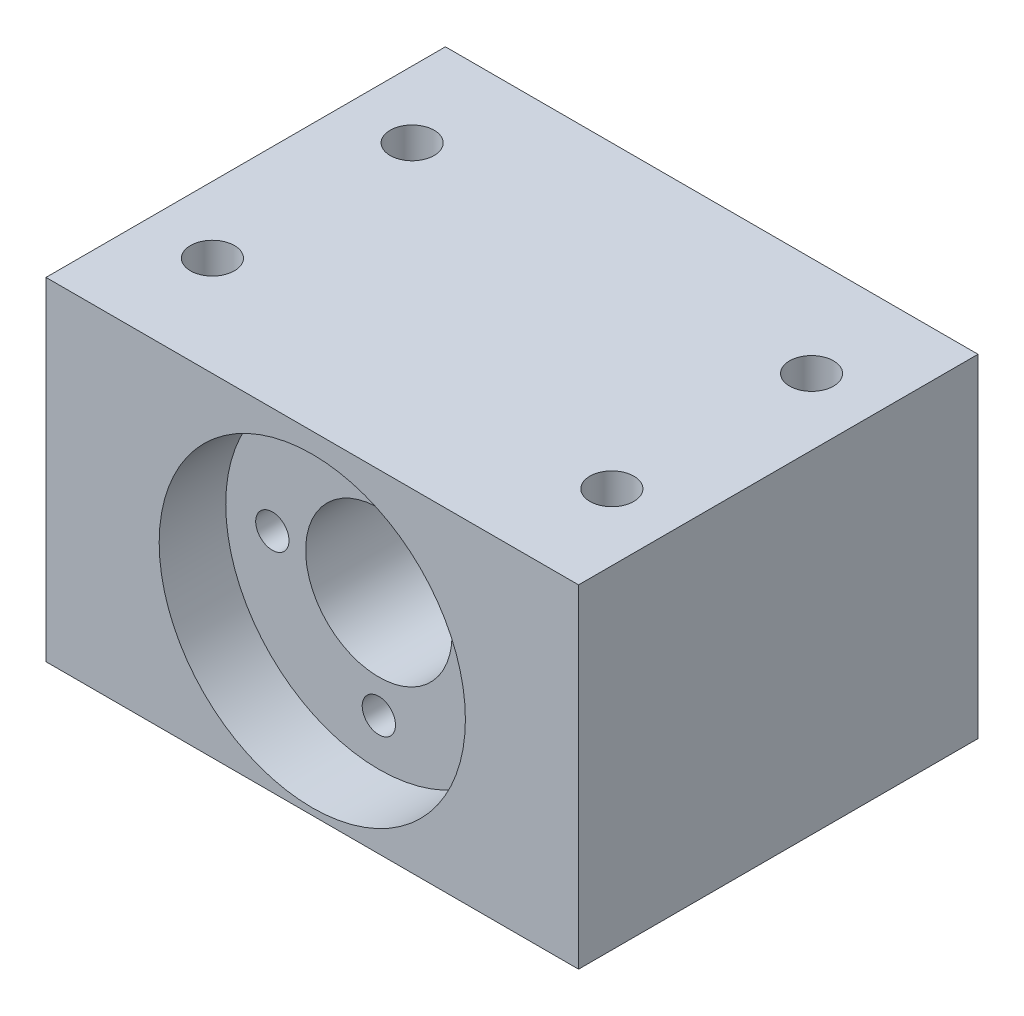
ISO-10303-21;
HEADER;
FILE_DESCRIPTION(('STEP AP214'),'2;1');
FILE_NAME('part.step','',(''),(''),'','','');
FILE_SCHEMA(('AUTOMOTIVE_DESIGN { 1 0 10303 214 1 1 1 1 }'));
ENDSEC;
DATA;
#1=APPLICATION_CONTEXT('core data for automotive mechanical design processes');
#2=APPLICATION_PROTOCOL_DEFINITION('international standard','automotive_design',2000,#1);
#3=PRODUCT_CONTEXT('',#1,'mechanical');
#4=PRODUCT('Part','Part','',(#3));
#5=PRODUCT_RELATED_PRODUCT_CATEGORY('part','',(#4));
#6=PRODUCT_DEFINITION_FORMATION('','',#4);
#7=PRODUCT_DEFINITION_CONTEXT('part definition',#1,'design');
#8=PRODUCT_DEFINITION('design','',#6,#7);
#9=PRODUCT_DEFINITION_SHAPE('','',#8);
#10=(LENGTH_UNIT() NAMED_UNIT(*) SI_UNIT(.MILLI.,.METRE.));
#11=(NAMED_UNIT(*) PLANE_ANGLE_UNIT() SI_UNIT($,.RADIAN.));
#12=(NAMED_UNIT(*) SI_UNIT($,.STERADIAN.) SOLID_ANGLE_UNIT());
#13=UNCERTAINTY_MEASURE_WITH_UNIT(LENGTH_MEASURE(1.E-05),#10,'distance_accuracy_value','');
#14=(GEOMETRIC_REPRESENTATION_CONTEXT(3) GLOBAL_UNCERTAINTY_ASSIGNED_CONTEXT((#13)) GLOBAL_UNIT_ASSIGNED_CONTEXT((#10,
#11,#12)) REPRESENTATION_CONTEXT('',''));
#15=CARTESIAN_POINT('',(0.,0.,0.));
#16=DIRECTION('',(0.,0.,1.));
#17=DIRECTION('',(1.,0.,0.));
#18=AXIS2_PLACEMENT_3D('',#15,#16,#17);
#19=CARTESIAN_POINT('',(20.,26.,15.));
#20=DIRECTION('',(0.,-1.,0.));
#21=DIRECTION('',(0.,0.,-1.));
#22=AXIS2_PLACEMENT_3D('',#19,#20,#21);
#23=PLANE('',#22);
#24=CARTESIAN_POINT('',(-15.,26.,-7.5));
#25=DIRECTION('',(0.,1.,0.));
#26=DIRECTION('',(0.,0.,1.));
#27=AXIS2_PLACEMENT_3D('',#24,#25,#26);
#28=CIRCLE('',#27,1.65);
#29=CARTESIAN_POINT('',(-15.,26.,-5.85));
#30=VERTEX_POINT('',#29);
#31=EDGE_CURVE('E125',#30,#30,#28,.T.);
#32=ORIENTED_EDGE('',*,*,#31,.F.);
#33=EDGE_LOOP('',(#32));
#34=FACE_BOUND('',#33,.T.);
#35=CARTESIAN_POINT('',(15.,26.,-7.5));
#36=DIRECTION('',(0.,1.,0.));
#37=DIRECTION('',(0.,0.,1.));
#38=AXIS2_PLACEMENT_3D('',#35,#36,#37);
#39=CIRCLE('',#38,1.65);
#40=CARTESIAN_POINT('',(15.,26.,-5.85));
#41=VERTEX_POINT('',#40);
#42=EDGE_CURVE('E122',#41,#41,#39,.T.);
#43=ORIENTED_EDGE('',*,*,#42,.F.);
#44=EDGE_LOOP('',(#43));
#45=FACE_BOUND('',#44,.T.);
#46=CARTESIAN_POINT('',(15.,26.,7.5));
#47=DIRECTION('',(0.,1.,0.));
#48=DIRECTION('',(0.,0.,1.));
#49=AXIS2_PLACEMENT_3D('',#46,#47,#48);
#50=CIRCLE('',#49,1.65);
#51=CARTESIAN_POINT('',(15.,26.,9.14999999999999));
#52=VERTEX_POINT('',#51);
#53=EDGE_CURVE('E119',#52,#52,#50,.T.);
#54=ORIENTED_EDGE('',*,*,#53,.F.);
#55=EDGE_LOOP('',(#54));
#56=FACE_BOUND('',#55,.T.);
#57=CARTESIAN_POINT('',(-15.,26.,7.50000000000001));
#58=DIRECTION('',(0.,1.,0.));
#59=DIRECTION('',(0.,0.,1.));
#60=AXIS2_PLACEMENT_3D('',#57,#58,#59);
#61=CIRCLE('',#60,1.65);
#62=CARTESIAN_POINT('',(-15.,26.,9.15));
#63=VERTEX_POINT('',#62);
#64=EDGE_CURVE('E114',#63,#63,#61,.T.);
#65=ORIENTED_EDGE('',*,*,#64,.F.);
#66=EDGE_LOOP('',(#65));
#67=FACE_BOUND('',#66,.T.);
#68=DIRECTION('',(-1.,0.,0.));
#69=VECTOR('',#68,1.);
#70=CARTESIAN_POINT('',(20.,26.,-15.));
#71=LINE('',#70,#69);
#72=CARTESIAN_POINT('',(20.,26.,-15.));
#73=VERTEX_POINT('',#72);
#74=CARTESIAN_POINT('',(-20.,26.,-15.));
#75=VERTEX_POINT('',#74);
#76=EDGE_CURVE('E92',#73,#75,#71,.T.);
#77=ORIENTED_EDGE('',*,*,#76,.T.);
#78=DIRECTION('',(0.,0.,-1.));
#79=VECTOR('',#78,1.);
#80=CARTESIAN_POINT('',(-20.,26.,15.));
#81=LINE('',#80,#79);
#82=CARTESIAN_POINT('',(-20.,26.,15.));
#83=VERTEX_POINT('',#82);
#84=EDGE_CURVE('E11',#83,#75,#81,.T.);
#85=ORIENTED_EDGE('',*,*,#84,.F.);
#86=DIRECTION('',(-1.,0.,0.));
#87=VECTOR('',#86,1.);
#88=CARTESIAN_POINT('',(20.,26.,15.));
#89=LINE('',#88,#87);
#90=CARTESIAN_POINT('',(20.,26.,15.));
#91=VERTEX_POINT('',#90);
#92=EDGE_CURVE('E86',#91,#83,#89,.T.);
#93=ORIENTED_EDGE('',*,*,#92,.F.);
#94=DIRECTION('',(0.,0.,-1.));
#95=VECTOR('',#94,1.);
#96=CARTESIAN_POINT('',(20.,26.,15.));
#97=LINE('',#96,#95);
#98=EDGE_CURVE('E48',#91,#73,#97,.T.);
#99=ORIENTED_EDGE('',*,*,#98,.T.);
#100=EDGE_LOOP('',(#77,#85,#93,#99));
#101=FACE_BOUND('',#100,.T.);
#102=ADVANCED_FACE('F40',(#34,#45,#56,#67,#101),#23,.F.);
#103=CARTESIAN_POINT('',(-20.,26.,15.));
#104=DIRECTION('',(1.,0.,0.));
#105=DIRECTION('',(0.,1.,0.));
#106=AXIS2_PLACEMENT_3D('',#103,#104,#105);
#107=PLANE('',#106);
#108=DIRECTION('',(0.,-1.,0.));
#109=VECTOR('',#108,1.);
#110=CARTESIAN_POINT('',(-20.,26.,-15.));
#111=LINE('',#110,#109);
#112=CARTESIAN_POINT('',(-20.,1.,-15.));
#113=VERTEX_POINT('',#112);
#114=EDGE_CURVE('E87',#75,#113,#111,.T.);
#115=ORIENTED_EDGE('',*,*,#114,.T.);
#116=DIRECTION('',(0.,0.,1.));
#117=VECTOR('',#116,1.);
#118=CARTESIAN_POINT('',(-20.,1.,-15.));
#119=LINE('',#118,#117);
#120=CARTESIAN_POINT('',(-20.,1.,15.));
#121=VERTEX_POINT('',#120);
#122=EDGE_CURVE('E55',#113,#121,#119,.T.);
#123=ORIENTED_EDGE('',*,*,#122,.T.);
#124=DIRECTION('',(0.,-1.,0.));
#125=VECTOR('',#124,1.);
#126=CARTESIAN_POINT('',(-20.,26.,15.));
#127=LINE('',#126,#125);
#128=EDGE_CURVE('E104',#83,#121,#127,.T.);
#129=ORIENTED_EDGE('',*,*,#128,.F.);
#130=ORIENTED_EDGE('',*,*,#84,.T.);
#131=EDGE_LOOP('',(#115,#123,#129,#130));
#132=FACE_BOUND('',#131,.T.);
#133=ADVANCED_FACE('F167',(#132),#107,.F.);
#134=CARTESIAN_POINT('',(20.,26.,15.));
#135=DIRECTION('',(-1.,0.,0.));
#136=DIRECTION('',(0.,-1.,0.));
#137=AXIS2_PLACEMENT_3D('',#134,#135,#136);
#138=PLANE('',#137);
#139=DIRECTION('',(0.,1.,0.));
#140=VECTOR('',#139,1.);
#141=CARTESIAN_POINT('',(20.,26.,15.));
#142=LINE('',#141,#140);
#143=CARTESIAN_POINT('',(20.,1.,15.));
#144=VERTEX_POINT('',#143);
#145=EDGE_CURVE('E64',#144,#91,#142,.T.);
#146=ORIENTED_EDGE('',*,*,#145,.F.);
#147=DIRECTION('',(0.,0.,1.));
#148=VECTOR('',#147,1.);
#149=CARTESIAN_POINT('',(20.,1.,-15.));
#150=LINE('',#149,#148);
#151=CARTESIAN_POINT('',(20.,1.,-15.));
#152=VERTEX_POINT('',#151);
#153=EDGE_CURVE('E83',#152,#144,#150,.T.);
#154=ORIENTED_EDGE('',*,*,#153,.F.);
#155=DIRECTION('',(0.,1.,0.));
#156=VECTOR('',#155,1.);
#157=CARTESIAN_POINT('',(20.,26.,-15.));
#158=LINE('',#157,#156);
#159=EDGE_CURVE('E78',#152,#73,#158,.T.);
#160=ORIENTED_EDGE('',*,*,#159,.T.);
#161=ORIENTED_EDGE('',*,*,#98,.F.);
#162=EDGE_LOOP('',(#146,#154,#160,#161));
#163=FACE_BOUND('',#162,.T.);
#164=ADVANCED_FACE('F80',(#163),#138,.F.);
#165=CARTESIAN_POINT('',(0.,0.,15.));
#166=DIRECTION('',(0.,0.,1.));
#167=DIRECTION('',(1.,0.,0.));
#168=AXIS2_PLACEMENT_3D('',#165,#166,#167);
#169=PLANE('',#168);
#170=DIRECTION('',(-1.,0.,0.));
#171=VECTOR('',#170,1.);
#172=CARTESIAN_POINT('',(-20.,1.,15.));
#173=LINE('',#172,#171);
#174=EDGE_CURVE('E164',#144,#121,#173,.T.);
#175=ORIENTED_EDGE('',*,*,#174,.F.);
#176=ORIENTED_EDGE('',*,*,#145,.T.);
#177=ORIENTED_EDGE('',*,*,#92,.T.);
#178=ORIENTED_EDGE('',*,*,#128,.T.);
#179=EDGE_LOOP('',(#175,#176,#177,#178));
#180=FACE_BOUND('',#179,.T.);
#181=CARTESIAN_POINT('',(0.,13.,15.));
#182=DIRECTION('',(0.,0.,1.));
#183=DIRECTION('',(1.,0.,0.));
#184=AXIS2_PLACEMENT_3D('',#181,#182,#183);
#185=CIRCLE('',#184,11.5);
#186=CARTESIAN_POINT('',(11.5,13.,15.));
#187=VERTEX_POINT('',#186);
#188=EDGE_CURVE('E100',#187,#187,#185,.T.);
#189=ORIENTED_EDGE('',*,*,#188,.F.);
#190=EDGE_LOOP('',(#189));
#191=FACE_BOUND('',#190,.T.);
#192=ADVANCED_FACE('F169',(#180,#191),#169,.T.);
#193=CARTESIAN_POINT('',(0.,0.,-15.));
#194=DIRECTION('',(0.,0.,1.));
#195=DIRECTION('',(1.,0.,0.));
#196=AXIS2_PLACEMENT_3D('',#193,#194,#195);
#197=PLANE('',#196);
#198=CARTESIAN_POINT('',(0.,21.,-15.));
#199=DIRECTION('',(0.,0.,1.));
#200=DIRECTION('',(1.,0.,0.));
#201=AXIS2_PLACEMENT_3D('',#198,#199,#200);
#202=CIRCLE('',#201,1.25);
#203=CARTESIAN_POINT('',(1.24999999999999,21.,-15.));
#204=VERTEX_POINT('',#203);
#205=EDGE_CURVE('E146',#204,#204,#202,.T.);
#206=ORIENTED_EDGE('',*,*,#205,.T.);
#207=EDGE_LOOP('',(#206));
#208=FACE_BOUND('',#207,.T.);
#209=CARTESIAN_POINT('',(0.,5.,-15.));
#210=DIRECTION('',(0.,0.,1.));
#211=DIRECTION('',(1.,0.,0.));
#212=AXIS2_PLACEMENT_3D('',#209,#210,#211);
#213=CIRCLE('',#212,1.25);
#214=CARTESIAN_POINT('',(1.25,5.,-15.));
#215=VERTEX_POINT('',#214);
#216=EDGE_CURVE('E140',#215,#215,#213,.T.);
#217=ORIENTED_EDGE('',*,*,#216,.T.);
#218=EDGE_LOOP('',(#217));
#219=FACE_BOUND('',#218,.T.);
#220=CARTESIAN_POINT('',(-8.,13.,-15.));
#221=DIRECTION('',(0.,0.,1.));
#222=DIRECTION('',(1.,0.,0.));
#223=AXIS2_PLACEMENT_3D('',#220,#221,#222);
#224=CIRCLE('',#223,1.25);
#225=CARTESIAN_POINT('',(-6.75000000000001,13.,-15.));
#226=VERTEX_POINT('',#225);
#227=EDGE_CURVE('E134',#226,#226,#224,.T.);
#228=ORIENTED_EDGE('',*,*,#227,.T.);
#229=EDGE_LOOP('',(#228));
#230=FACE_BOUND('',#229,.T.);
#231=CARTESIAN_POINT('',(8.,13.,-15.));
#232=DIRECTION('',(0.,0.,1.));
#233=DIRECTION('',(1.,0.,0.));
#234=AXIS2_PLACEMENT_3D('',#231,#232,#233);
#235=CIRCLE('',#234,1.24999999999999);
#236=CARTESIAN_POINT('',(9.24999999999999,13.,-15.));
#237=VERTEX_POINT('',#236);
#238=EDGE_CURVE('E128',#237,#237,#235,.T.);
#239=ORIENTED_EDGE('',*,*,#238,.T.);
#240=EDGE_LOOP('',(#239));
#241=FACE_BOUND('',#240,.T.);
#242=CARTESIAN_POINT('',(0.,13.,-15.));
#243=DIRECTION('',(0.,0.,1.));
#244=DIRECTION('',(1.,0.,0.));
#245=AXIS2_PLACEMENT_3D('',#242,#243,#244);
#246=CIRCLE('',#245,5.5);
#247=CARTESIAN_POINT('',(5.5,13.,-15.));
#248=VERTEX_POINT('',#247);
#249=EDGE_CURVE('E109',#248,#248,#246,.T.);
#250=ORIENTED_EDGE('',*,*,#249,.T.);
#251=EDGE_LOOP('',(#250));
#252=FACE_BOUND('',#251,.T.);
#253=ORIENTED_EDGE('',*,*,#159,.F.);
#254=DIRECTION('',(-1.,0.,0.));
#255=VECTOR('',#254,1.);
#256=CARTESIAN_POINT('',(-20.,1.,-15.));
#257=LINE('',#256,#255);
#258=EDGE_CURVE('E162',#152,#113,#257,.T.);
#259=ORIENTED_EDGE('',*,*,#258,.T.);
#260=ORIENTED_EDGE('',*,*,#114,.F.);
#261=ORIENTED_EDGE('',*,*,#76,.F.);
#262=EDGE_LOOP('',(#253,#259,#260,#261));
#263=FACE_BOUND('',#262,.T.);
#264=ADVANCED_FACE('F94',(#208,#219,#230,#241,#252,#263),#197,.F.);
#265=CARTESIAN_POINT('',(0.,13.,10.));
#266=DIRECTION('',(0.,0.,1.));
#267=DIRECTION('',(1.,0.,0.));
#268=AXIS2_PLACEMENT_3D('',#265,#266,#267);
#269=CYLINDRICAL_SURFACE('',#268,11.5);
#270=CARTESIAN_POINT('',(0.,13.,10.));
#271=DIRECTION('',(0.,0.,1.));
#272=DIRECTION('',(1.,0.,0.));
#273=AXIS2_PLACEMENT_3D('',#270,#271,#272);
#274=CIRCLE('',#273,11.5);
#275=CARTESIAN_POINT('',(11.5,13.,10.));
#276=VERTEX_POINT('',#275);
#277=EDGE_CURVE('E96',#276,#276,#274,.T.);
#278=ORIENTED_EDGE('',*,*,#277,.F.);
#279=EDGE_LOOP('',(#278));
#280=FACE_BOUND('',#279,.T.);
#281=ORIENTED_EDGE('',*,*,#188,.T.);
#282=EDGE_LOOP('',(#281));
#283=FACE_BOUND('',#282,.T.);
#284=ADVANCED_FACE('F176',(#280,#283),#269,.F.);
#285=CARTESIAN_POINT('',(0.,13.,10.));
#286=DIRECTION('',(0.,0.,1.));
#287=DIRECTION('',(1.,0.,0.));
#288=AXIS2_PLACEMENT_3D('',#285,#286,#287);
#289=PLANE('',#288);
#290=CARTESIAN_POINT('',(0.,21.,10.));
#291=DIRECTION('',(0.,0.,1.));
#292=DIRECTION('',(1.,0.,0.));
#293=AXIS2_PLACEMENT_3D('',#290,#291,#292);
#294=CIRCLE('',#293,1.25);
#295=CARTESIAN_POINT('',(1.25,21.,10.));
#296=VERTEX_POINT('',#295);
#297=EDGE_CURVE('E149',#296,#296,#294,.T.);
#298=ORIENTED_EDGE('',*,*,#297,.F.);
#299=EDGE_LOOP('',(#298));
#300=FACE_BOUND('',#299,.T.);
#301=CARTESIAN_POINT('',(0.,5.,10.));
#302=DIRECTION('',(0.,0.,1.));
#303=DIRECTION('',(1.,0.,0.));
#304=AXIS2_PLACEMENT_3D('',#301,#302,#303);
#305=CIRCLE('',#304,1.25);
#306=CARTESIAN_POINT('',(1.25,5.,10.));
#307=VERTEX_POINT('',#306);
#308=EDGE_CURVE('E143',#307,#307,#305,.T.);
#309=ORIENTED_EDGE('',*,*,#308,.F.);
#310=EDGE_LOOP('',(#309));
#311=FACE_BOUND('',#310,.T.);
#312=CARTESIAN_POINT('',(-8.,13.,10.));
#313=DIRECTION('',(0.,0.,1.));
#314=DIRECTION('',(1.,0.,0.));
#315=AXIS2_PLACEMENT_3D('',#312,#313,#314);
#316=CIRCLE('',#315,1.25);
#317=CARTESIAN_POINT('',(-6.75,13.,10.));
#318=VERTEX_POINT('',#317);
#319=EDGE_CURVE('E137',#318,#318,#316,.T.);
#320=ORIENTED_EDGE('',*,*,#319,.F.);
#321=EDGE_LOOP('',(#320));
#322=FACE_BOUND('',#321,.T.);
#323=CARTESIAN_POINT('',(8.,13.,10.));
#324=DIRECTION('',(0.,0.,1.));
#325=DIRECTION('',(1.,0.,0.));
#326=AXIS2_PLACEMENT_3D('',#323,#324,#325);
#327=CIRCLE('',#326,1.25);
#328=CARTESIAN_POINT('',(9.25,13.,10.));
#329=VERTEX_POINT('',#328);
#330=EDGE_CURVE('E131',#329,#329,#327,.T.);
#331=ORIENTED_EDGE('',*,*,#330,.F.);
#332=EDGE_LOOP('',(#331));
#333=FACE_BOUND('',#332,.T.);
#334=CARTESIAN_POINT('',(0.,13.,10.));
#335=DIRECTION('',(0.,0.,1.));
#336=DIRECTION('',(1.,0.,0.));
#337=AXIS2_PLACEMENT_3D('',#334,#335,#336);
#338=CIRCLE('',#337,5.5);
#339=CARTESIAN_POINT('',(5.5,13.,10.));
#340=VERTEX_POINT('',#339);
#341=EDGE_CURVE('E111',#340,#340,#338,.T.);
#342=ORIENTED_EDGE('',*,*,#341,.F.);
#343=EDGE_LOOP('',(#342));
#344=FACE_BOUND('',#343,.T.);
#345=ORIENTED_EDGE('',*,*,#277,.T.);
#346=EDGE_LOOP('',(#345));
#347=FACE_BOUND('',#346,.T.);
#348=ADVANCED_FACE('F178',(#300,#311,#322,#333,#344,#347),#289,.T.);
#349=CARTESIAN_POINT('',(0.,13.,-15.));
#350=DIRECTION('',(0.,0.,1.));
#351=DIRECTION('',(1.,0.,0.));
#352=AXIS2_PLACEMENT_3D('',#349,#350,#351);
#353=CYLINDRICAL_SURFACE('',#352,5.5);
#354=CARTESIAN_POINT('',(5.5,13.,-15.));
#355=CARTESIAN_POINT('',(5.5,13.,-14.7395833333333));
#356=CARTESIAN_POINT('',(5.5,13.,-14.4791666666667));
#357=CARTESIAN_POINT('',(5.5,13.,-13.9583333333333));
#358=CARTESIAN_POINT('',(5.5,13.,-13.6979166666667));
#359=CARTESIAN_POINT('',(5.5,13.,-13.1770833333333));
#360=CARTESIAN_POINT('',(5.5,13.,-12.9166666666667));
#361=CARTESIAN_POINT('',(5.5,13.,-12.3958333333333));
#362=CARTESIAN_POINT('',(5.5,13.,-12.1354166666667));
#363=CARTESIAN_POINT('',(5.5,13.,-11.6145833333333));
#364=CARTESIAN_POINT('',(5.5,13.,-11.3541666666667));
#365=CARTESIAN_POINT('',(5.5,13.,-10.8333333333333));
#366=CARTESIAN_POINT('',(5.5,13.,-10.5729166666667));
#367=CARTESIAN_POINT('',(5.5,13.,-10.0520833333333));
#368=CARTESIAN_POINT('',(5.5,13.,-9.79166666666667));
#369=CARTESIAN_POINT('',(5.5,13.,-9.27083333333333));
#370=CARTESIAN_POINT('',(5.5,13.,-9.01041666666667));
#371=CARTESIAN_POINT('',(5.5,13.,-8.48958333333333));
#372=CARTESIAN_POINT('',(5.5,13.,-8.22916666666667));
#373=CARTESIAN_POINT('',(5.5,13.,-7.70833333333333));
#374=CARTESIAN_POINT('',(5.5,13.,-7.44791666666667));
#375=CARTESIAN_POINT('',(5.5,13.,-6.92708333333333));
#376=CARTESIAN_POINT('',(5.5,13.,-6.66666666666667));
#377=CARTESIAN_POINT('',(5.5,13.,-6.14583333333334));
#378=CARTESIAN_POINT('',(5.5,13.,-5.88541666666667));
#379=CARTESIAN_POINT('',(5.5,13.,-5.36458333333333));
#380=CARTESIAN_POINT('',(5.5,13.,-5.10416666666667));
#381=CARTESIAN_POINT('',(5.5,13.,-4.58333333333334));
#382=CARTESIAN_POINT('',(5.5,13.,-4.32291666666667));
#383=CARTESIAN_POINT('',(5.5,13.,-3.80208333333334));
#384=CARTESIAN_POINT('',(5.5,13.,-3.54166666666667));
#385=CARTESIAN_POINT('',(5.5,13.,-3.02083333333334));
#386=CARTESIAN_POINT('',(5.5,13.,-2.76041666666667));
#387=CARTESIAN_POINT('',(5.5,13.,-2.23958333333334));
#388=CARTESIAN_POINT('',(5.5,13.,-1.97916666666667));
#389=CARTESIAN_POINT('',(5.5,13.,-1.45833333333334));
#390=CARTESIAN_POINT('',(5.5,13.,-1.19791666666667));
#391=CARTESIAN_POINT('',(5.5,13.,-0.677083333333336));
#392=CARTESIAN_POINT('',(5.5,13.,-0.416666666666669));
#393=CARTESIAN_POINT('',(5.5,13.,0.104166666666664));
#394=CARTESIAN_POINT('',(5.5,13.,0.364583333333331));
#395=CARTESIAN_POINT('',(5.5,13.,0.885416666666664));
#396=CARTESIAN_POINT('',(5.5,13.,1.14583333333333));
#397=CARTESIAN_POINT('',(5.5,13.,1.66666666666666));
#398=CARTESIAN_POINT('',(5.5,13.,1.92708333333333));
#399=CARTESIAN_POINT('',(5.5,13.,2.44791666666667));
#400=CARTESIAN_POINT('',(5.5,13.,2.70833333333333));
#401=CARTESIAN_POINT('',(5.5,13.,3.22916666666667));
#402=CARTESIAN_POINT('',(5.5,13.,3.48958333333333));
#403=CARTESIAN_POINT('',(5.5,13.,4.01041666666667));
#404=CARTESIAN_POINT('',(5.5,13.,4.27083333333333));
#405=CARTESIAN_POINT('',(5.5,13.,4.79166666666666));
#406=CARTESIAN_POINT('',(5.5,13.,5.05208333333333));
#407=CARTESIAN_POINT('',(5.5,13.,5.57291666666666));
#408=CARTESIAN_POINT('',(5.5,13.,5.83333333333333));
#409=CARTESIAN_POINT('',(5.5,13.,6.35416666666667));
#410=CARTESIAN_POINT('',(5.5,13.,6.61458333333333));
#411=CARTESIAN_POINT('',(5.5,13.,7.13541666666667));
#412=CARTESIAN_POINT('',(5.5,13.,7.39583333333333));
#413=CARTESIAN_POINT('',(5.5,13.,7.91666666666667));
#414=CARTESIAN_POINT('',(5.5,13.,8.17708333333333));
#415=CARTESIAN_POINT('',(5.5,13.,8.69791666666666));
#416=CARTESIAN_POINT('',(5.5,13.,8.95833333333333));
#417=CARTESIAN_POINT('',(5.5,13.,9.47916666666667));
#418=CARTESIAN_POINT('',(5.5,13.,9.73958333333333));
#419=CARTESIAN_POINT('',(5.5,13.,10.));
#420=B_SPLINE_CURVE_WITH_KNOTS('',3,(#354,#355,#356,#357,#358,#359,#360,#361,#362,#363,#364,
#365,#366,#367,#368,#369,#370,#371,#372,#373,#374,#375,#376,#377,#378,#379,#380,#381,#382,#383,
#384,#385,#386,#387,#388,#389,#390,#391,#392,#393,#394,#395,#396,#397,#398,#399,#400,#401,#402,
#403,#404,#405,#406,#407,#408,#409,#410,#411,#412,#413,#414,#415,#416,#417,#418,#419),
.UNSPECIFIED.,.F.,.F.,(4,2,2,2,2,2,2,2,2,2,2,2,2,2,2,2,2,2,2,2,2,2,2,2,2,2,2,2,2,2,2,2,4),(0.,
0.781250000000001,1.5625,2.34375,3.125,3.90625,4.6875,5.46875,6.25,7.03125,7.8125,8.59375,9.375,
10.15625,10.9375,11.71875,12.5,13.28125,14.0625,14.84375,15.625,16.40625,17.1875,17.96875,18.75,
19.53125,20.3125,21.09375,21.875,22.65625,23.4375,24.21875,25.),.UNSPECIFIED.);
#421=EDGE_CURVE('BSEAM185',#248,#340,#420,.T.);
#422=ORIENTED_EDGE('',*,*,#249,.F.);
#423=ORIENTED_EDGE('',*,*,#341,.T.);
#424=ORIENTED_EDGE('',*,*,#421,.T.);
#425=ORIENTED_EDGE('',*,*,#421,.F.);
#426=EDGE_LOOP('',(#422,#424,#423,#425));
#427=FACE_BOUND('',#426,.T.);
#428=ADVANCED_FACE('F185',(#427),#353,.F.);
#429=CARTESIAN_POINT('',(-15.,26.,7.50000000000001));
#430=DIRECTION('',(0.,1.,0.));
#431=DIRECTION('',(0.,0.,1.));
#432=AXIS2_PLACEMENT_3D('',#429,#430,#431);
#433=CYLINDRICAL_SURFACE('',#432,1.65);
#434=CARTESIAN_POINT('',(-15.,1.,7.50000000000001));
#435=DIRECTION('',(0.,1.,0.));
#436=DIRECTION('',(0.,0.,1.));
#437=AXIS2_PLACEMENT_3D('',#434,#435,#436);
#438=CIRCLE('',#437,1.65);
#439=CARTESIAN_POINT('',(-15.,1.,9.15));
#440=VERTEX_POINT('',#439);
#441=EDGE_CURVE('E152',#440,#440,#438,.F.);
#442=ORIENTED_EDGE('',*,*,#441,.T.);
#443=EDGE_LOOP('',(#442));
#444=FACE_BOUND('',#443,.T.);
#445=ORIENTED_EDGE('',*,*,#64,.T.);
#446=EDGE_LOOP('',(#445));
#447=FACE_BOUND('',#446,.T.);
#448=ADVANCED_FACE('F204',(#444,#447),#433,.F.);
#449=CARTESIAN_POINT('',(15.,26.,7.5));
#450=DIRECTION('',(0.,1.,0.));
#451=DIRECTION('',(0.,0.,1.));
#452=AXIS2_PLACEMENT_3D('',#449,#450,#451);
#453=CYLINDRICAL_SURFACE('',#452,1.65);
#454=CARTESIAN_POINT('',(15.,1.,7.5));
#455=DIRECTION('',(0.,1.,0.));
#456=DIRECTION('',(0.,0.,1.));
#457=AXIS2_PLACEMENT_3D('',#454,#455,#456);
#458=CIRCLE('',#457,1.65);
#459=CARTESIAN_POINT('',(15.,1.,9.14999999999999));
#460=VERTEX_POINT('',#459);
#461=EDGE_CURVE('E155',#460,#460,#458,.F.);
#462=ORIENTED_EDGE('',*,*,#461,.T.);
#463=EDGE_LOOP('',(#462));
#464=FACE_BOUND('',#463,.T.);
#465=ORIENTED_EDGE('',*,*,#53,.T.);
#466=EDGE_LOOP('',(#465));
#467=FACE_BOUND('',#466,.T.);
#468=ADVANCED_FACE('F206',(#464,#467),#453,.F.);
#469=CARTESIAN_POINT('',(15.,26.,-7.5));
#470=DIRECTION('',(0.,1.,0.));
#471=DIRECTION('',(0.,0.,1.));
#472=AXIS2_PLACEMENT_3D('',#469,#470,#471);
#473=CYLINDRICAL_SURFACE('',#472,1.65);
#474=CARTESIAN_POINT('',(15.,1.,-7.5));
#475=DIRECTION('',(0.,1.,0.));
#476=DIRECTION('',(0.,0.,1.));
#477=AXIS2_PLACEMENT_3D('',#474,#475,#476);
#478=CIRCLE('',#477,1.65);
#479=CARTESIAN_POINT('',(15.,1.,-5.85));
#480=VERTEX_POINT('',#479);
#481=EDGE_CURVE('E158',#480,#480,#478,.F.);
#482=ORIENTED_EDGE('',*,*,#481,.T.);
#483=EDGE_LOOP('',(#482));
#484=FACE_BOUND('',#483,.T.);
#485=ORIENTED_EDGE('',*,*,#42,.T.);
#486=EDGE_LOOP('',(#485));
#487=FACE_BOUND('',#486,.T.);
#488=ADVANCED_FACE('F213',(#484,#487),#473,.F.);
#489=CARTESIAN_POINT('',(-15.,26.,-7.5));
#490=DIRECTION('',(0.,1.,0.));
#491=DIRECTION('',(0.,0.,1.));
#492=AXIS2_PLACEMENT_3D('',#489,#490,#491);
#493=CYLINDRICAL_SURFACE('',#492,1.65);
#494=CARTESIAN_POINT('',(-15.,1.,-7.5));
#495=DIRECTION('',(0.,1.,0.));
#496=DIRECTION('',(0.,0.,1.));
#497=AXIS2_PLACEMENT_3D('',#494,#495,#496);
#498=CIRCLE('',#497,1.65);
#499=CARTESIAN_POINT('',(-15.,1.,-5.85000000000001));
#500=VERTEX_POINT('',#499);
#501=EDGE_CURVE('E43',#500,#500,#498,.F.);
#502=ORIENTED_EDGE('',*,*,#501,.T.);
#503=EDGE_LOOP('',(#502));
#504=FACE_BOUND('',#503,.T.);
#505=ORIENTED_EDGE('',*,*,#31,.T.);
#506=EDGE_LOOP('',(#505));
#507=FACE_BOUND('',#506,.T.);
#508=ADVANCED_FACE('F221',(#504,#507),#493,.F.);
#509=CARTESIAN_POINT('',(8.,13.,10.));
#510=DIRECTION('',(0.,0.,1.));
#511=DIRECTION('',(1.,0.,0.));
#512=AXIS2_PLACEMENT_3D('',#509,#510,#511);
#513=CYLINDRICAL_SURFACE('',#512,1.25);
#514=ORIENTED_EDGE('',*,*,#238,.F.);
#515=EDGE_LOOP('',(#514));
#516=FACE_BOUND('',#515,.T.);
#517=ORIENTED_EDGE('',*,*,#330,.T.);
#518=EDGE_LOOP('',(#517));
#519=FACE_BOUND('',#518,.T.);
#520=ADVANCED_FACE('F225',(#516,#519),#513,.F.);
#521=CARTESIAN_POINT('',(-8.,13.,10.));
#522=DIRECTION('',(0.,0.,1.));
#523=DIRECTION('',(1.,0.,0.));
#524=AXIS2_PLACEMENT_3D('',#521,#522,#523);
#525=CYLINDRICAL_SURFACE('',#524,1.25);
#526=ORIENTED_EDGE('',*,*,#227,.F.);
#527=EDGE_LOOP('',(#526));
#528=FACE_BOUND('',#527,.T.);
#529=ORIENTED_EDGE('',*,*,#319,.T.);
#530=EDGE_LOOP('',(#529));
#531=FACE_BOUND('',#530,.T.);
#532=ADVANCED_FACE('F229',(#528,#531),#525,.F.);
#533=CARTESIAN_POINT('',(0.,5.,10.));
#534=DIRECTION('',(0.,0.,1.));
#535=DIRECTION('',(1.,0.,0.));
#536=AXIS2_PLACEMENT_3D('',#533,#534,#535);
#537=CYLINDRICAL_SURFACE('',#536,1.25);
#538=ORIENTED_EDGE('',*,*,#216,.F.);
#539=EDGE_LOOP('',(#538));
#540=FACE_BOUND('',#539,.T.);
#541=ORIENTED_EDGE('',*,*,#308,.T.);
#542=EDGE_LOOP('',(#541));
#543=FACE_BOUND('',#542,.T.);
#544=ADVANCED_FACE('F233',(#540,#543),#537,.F.);
#545=CARTESIAN_POINT('',(0.,21.,10.));
#546=DIRECTION('',(0.,0.,1.));
#547=DIRECTION('',(1.,0.,0.));
#548=AXIS2_PLACEMENT_3D('',#545,#546,#547);
#549=CYLINDRICAL_SURFACE('',#548,1.25);
#550=ORIENTED_EDGE('',*,*,#205,.F.);
#551=EDGE_LOOP('',(#550));
#552=FACE_BOUND('',#551,.T.);
#553=ORIENTED_EDGE('',*,*,#297,.T.);
#554=EDGE_LOOP('',(#553));
#555=FACE_BOUND('',#554,.T.);
#556=ADVANCED_FACE('F237',(#552,#555),#549,.F.);
#557=CARTESIAN_POINT('',(-20.,1.,-15.));
#558=DIRECTION('',(0.,1.,0.));
#559=DIRECTION('',(0.,0.,1.));
#560=AXIS2_PLACEMENT_3D('',#557,#558,#559);
#561=PLANE('',#560);
#562=ORIENTED_EDGE('',*,*,#461,.F.);
#563=EDGE_LOOP('',(#562));
#564=FACE_BOUND('',#563,.T.);
#565=ORIENTED_EDGE('',*,*,#501,.F.);
#566=EDGE_LOOP('',(#565));
#567=FACE_BOUND('',#566,.T.);
#568=ORIENTED_EDGE('',*,*,#174,.T.);
#569=ORIENTED_EDGE('',*,*,#122,.F.);
#570=ORIENTED_EDGE('',*,*,#258,.F.);
#571=ORIENTED_EDGE('',*,*,#153,.T.);
#572=EDGE_LOOP('',(#568,#569,#570,#571));
#573=FACE_BOUND('',#572,.T.);
#574=ORIENTED_EDGE('',*,*,#481,.F.);
#575=EDGE_LOOP('',(#574));
#576=FACE_BOUND('',#575,.T.);
#577=ORIENTED_EDGE('',*,*,#441,.F.);
#578=EDGE_LOOP('',(#577));
#579=FACE_BOUND('',#578,.T.);
#580=ADVANCED_FACE('F241',(#564,#567,#573,#576,#579),#561,.F.);
#581=CLOSED_SHELL('',(#102,#133,#164,#192,#264,#284,#348,#428,#448,#468,#488,#508,#520,#532,
#544,#556,#580));
#582=MANIFOLD_SOLID_BREP('B2',#581);
#583=ADVANCED_BREP_SHAPE_REPRESENTATION('',(#18,#582),#14);
#584=SHAPE_DEFINITION_REPRESENTATION(#9,#583);
ENDSEC;
END-ISO-10303-21;
